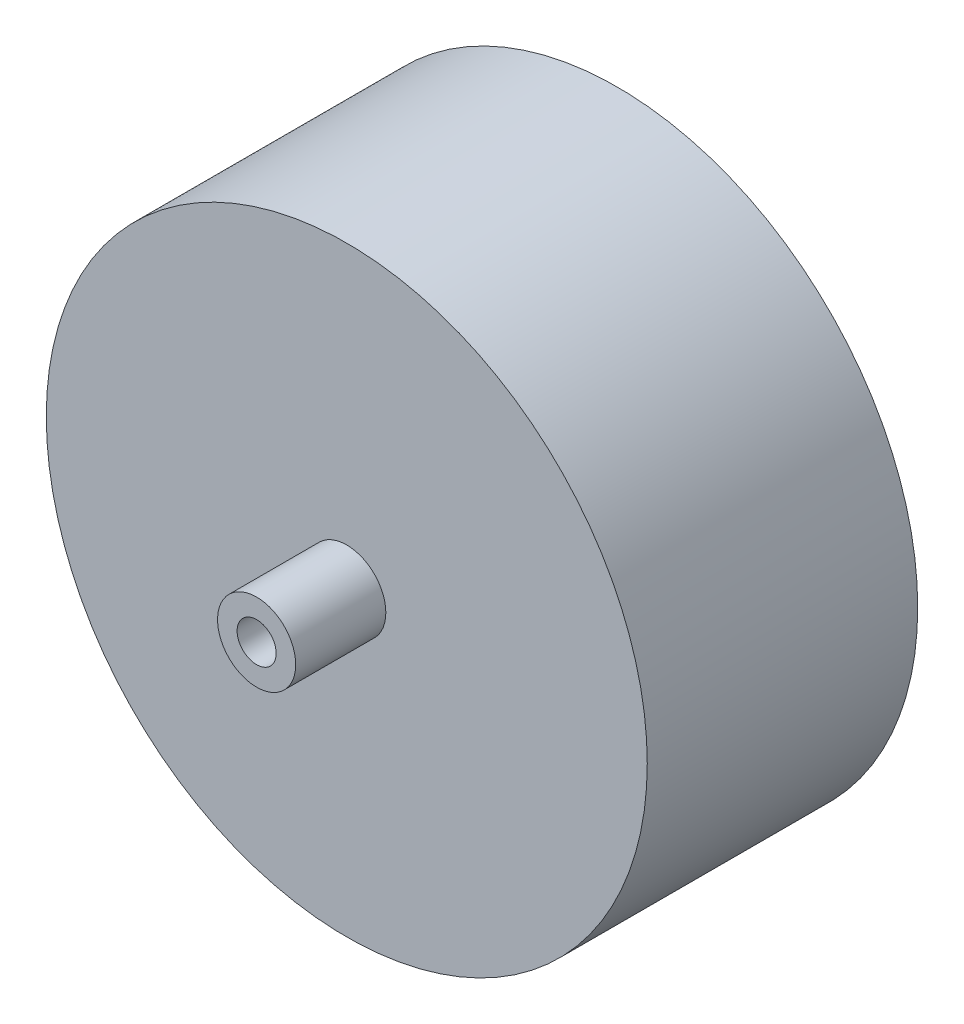
ISO-10303-21;
HEADER;
FILE_DESCRIPTION(('STEP AP214'),'2;1');
FILE_NAME('part.step','',(''),(''),'','','');
FILE_SCHEMA(('AUTOMOTIVE_DESIGN { 1 0 10303 214 1 1 1 1 }'));
ENDSEC;
DATA;
#1=APPLICATION_CONTEXT('core data for automotive mechanical design processes');
#2=APPLICATION_PROTOCOL_DEFINITION('international standard','automotive_design',2000,#1);
#3=PRODUCT_CONTEXT('',#1,'mechanical');
#4=PRODUCT('Part','Part','',(#3));
#5=PRODUCT_RELATED_PRODUCT_CATEGORY('part','',(#4));
#6=PRODUCT_DEFINITION_FORMATION('','',#4);
#7=PRODUCT_DEFINITION_CONTEXT('part definition',#1,'design');
#8=PRODUCT_DEFINITION('design','',#6,#7);
#9=PRODUCT_DEFINITION_SHAPE('','',#8);
#10=(LENGTH_UNIT() NAMED_UNIT(*) SI_UNIT(.MILLI.,.METRE.));
#11=(NAMED_UNIT(*) PLANE_ANGLE_UNIT() SI_UNIT($,.RADIAN.));
#12=(NAMED_UNIT(*) SI_UNIT($,.STERADIAN.) SOLID_ANGLE_UNIT());
#13=UNCERTAINTY_MEASURE_WITH_UNIT(LENGTH_MEASURE(1.E-05),#10,'distance_accuracy_value','');
#14=(GEOMETRIC_REPRESENTATION_CONTEXT(3) GLOBAL_UNCERTAINTY_ASSIGNED_CONTEXT((#13)) GLOBAL_UNIT_ASSIGNED_CONTEXT((#10,
#11,#12)) REPRESENTATION_CONTEXT('',''));
#15=CARTESIAN_POINT('',(0.,0.,0.));
#16=DIRECTION('',(0.,0.,1.));
#17=DIRECTION('',(1.,0.,0.));
#18=AXIS2_PLACEMENT_3D('',#15,#16,#17);
#19=CARTESIAN_POINT('',(0.,0.,45.));
#20=DIRECTION('',(0.,0.,-1.));
#21=DIRECTION('',(-1.,0.,0.));
#22=AXIS2_PLACEMENT_3D('',#19,#20,#21);
#23=CYLINDRICAL_SURFACE('',#22,50.);
#24=CARTESIAN_POINT('',(0.,0.,45.));
#25=DIRECTION('',(0.,0.,1.));
#26=DIRECTION('',(1.,0.,0.));
#27=AXIS2_PLACEMENT_3D('',#24,#25,#26);
#28=CIRCLE('',#27,50.);
#29=CARTESIAN_POINT('',(-50.,0.,45.));
#30=VERTEX_POINT('',#29);
#31=EDGE_CURVE('E42',#30,#30,#28,.T.);
#32=CARTESIAN_POINT('',(0.,0.,0.));
#33=DIRECTION('',(0.,0.,1.));
#34=DIRECTION('',(1.,0.,0.));
#35=AXIS2_PLACEMENT_3D('',#32,#33,#34);
#36=CIRCLE('',#35,50.);
#37=CARTESIAN_POINT('',(-50.,0.,0.));
#38=VERTEX_POINT('',#37);
#39=EDGE_CURVE('E37',#38,#38,#36,.T.);
#40=CARTESIAN_POINT('',(-50.,0.,45.));
#41=CARTESIAN_POINT('',(-50.,0.,44.53125));
#42=CARTESIAN_POINT('',(-50.,0.,44.0625));
#43=CARTESIAN_POINT('',(-50.,0.,43.125));
#44=CARTESIAN_POINT('',(-50.,0.,42.65625));
#45=CARTESIAN_POINT('',(-50.,0.,41.71875));
#46=CARTESIAN_POINT('',(-50.,0.,41.25));
#47=CARTESIAN_POINT('',(-50.,0.,40.3125));
#48=CARTESIAN_POINT('',(-50.,0.,39.84375));
#49=CARTESIAN_POINT('',(-50.,0.,38.90625));
#50=CARTESIAN_POINT('',(-50.,0.,38.4375));
#51=CARTESIAN_POINT('',(-50.,0.,37.5));
#52=CARTESIAN_POINT('',(-50.,0.,37.03125));
#53=CARTESIAN_POINT('',(-50.,0.,36.09375));
#54=CARTESIAN_POINT('',(-50.,0.,35.625));
#55=CARTESIAN_POINT('',(-50.,0.,34.6875));
#56=CARTESIAN_POINT('',(-50.,0.,34.21875));
#57=CARTESIAN_POINT('',(-50.,0.,33.28125));
#58=CARTESIAN_POINT('',(-50.,0.,32.8125));
#59=CARTESIAN_POINT('',(-50.,0.,31.875));
#60=CARTESIAN_POINT('',(-50.,0.,31.40625));
#61=CARTESIAN_POINT('',(-50.,0.,30.46875));
#62=CARTESIAN_POINT('',(-50.,0.,30.));
#63=CARTESIAN_POINT('',(-50.,0.,29.0625));
#64=CARTESIAN_POINT('',(-50.,0.,28.59375));
#65=CARTESIAN_POINT('',(-50.,0.,27.65625));
#66=CARTESIAN_POINT('',(-50.,0.,27.1875));
#67=CARTESIAN_POINT('',(-50.,0.,26.25));
#68=CARTESIAN_POINT('',(-50.,0.,25.78125));
#69=CARTESIAN_POINT('',(-50.,0.,24.84375));
#70=CARTESIAN_POINT('',(-50.,0.,24.375));
#71=CARTESIAN_POINT('',(-50.,0.,23.4375));
#72=CARTESIAN_POINT('',(-50.,0.,22.96875));
#73=CARTESIAN_POINT('',(-50.,0.,22.03125));
#74=CARTESIAN_POINT('',(-50.,0.,21.5625));
#75=CARTESIAN_POINT('',(-50.,0.,20.625));
#76=CARTESIAN_POINT('',(-50.,0.,20.15625));
#77=CARTESIAN_POINT('',(-50.,0.,19.21875));
#78=CARTESIAN_POINT('',(-50.,0.,18.75));
#79=CARTESIAN_POINT('',(-50.,0.,17.8125));
#80=CARTESIAN_POINT('',(-50.,0.,17.34375));
#81=CARTESIAN_POINT('',(-50.,0.,16.40625));
#82=CARTESIAN_POINT('',(-50.,0.,15.9375));
#83=CARTESIAN_POINT('',(-50.,0.,15.));
#84=CARTESIAN_POINT('',(-50.,0.,14.53125));
#85=CARTESIAN_POINT('',(-50.,0.,13.59375));
#86=CARTESIAN_POINT('',(-50.,0.,13.125));
#87=CARTESIAN_POINT('',(-50.,0.,12.1875));
#88=CARTESIAN_POINT('',(-50.,0.,11.71875));
#89=CARTESIAN_POINT('',(-50.,0.,10.78125));
#90=CARTESIAN_POINT('',(-50.,0.,10.3125));
#91=CARTESIAN_POINT('',(-50.,0.,9.375));
#92=CARTESIAN_POINT('',(-50.,0.,8.90625));
#93=CARTESIAN_POINT('',(-50.,0.,7.96874999999999));
#94=CARTESIAN_POINT('',(-50.,0.,7.5));
#95=CARTESIAN_POINT('',(-50.,0.,6.5625));
#96=CARTESIAN_POINT('',(-50.,0.,6.09375));
#97=CARTESIAN_POINT('',(-50.,0.,5.15625));
#98=CARTESIAN_POINT('',(-50.,0.,4.68749999999999));
#99=CARTESIAN_POINT('',(-50.,0.,3.74999999999999));
#100=CARTESIAN_POINT('',(-50.,0.,3.28124999999999));
#101=CARTESIAN_POINT('',(-50.,0.,2.34374999999999));
#102=CARTESIAN_POINT('',(-50.,0.,1.87499999999999));
#103=CARTESIAN_POINT('',(-50.,0.,0.937499999999992));
#104=CARTESIAN_POINT('',(-50.,0.,0.468749999999993));
#105=CARTESIAN_POINT('',(-50.,0.,0.));
#106=B_SPLINE_CURVE_WITH_KNOTS('',3,(#40,#41,#42,#43,#44,#45,#46,#47,#48,#49,#50,#51,#52,#53,
#54,#55,#56,#57,#58,#59,#60,#61,#62,#63,#64,#65,#66,#67,#68,#69,#70,#71,#72,#73,#74,#75,#76,#77,
#78,#79,#80,#81,#82,#83,#84,#85,#86,#87,#88,#89,#90,#91,#92,#93,#94,#95,#96,#97,#98,#99,#100,
#101,#102,#103,#104,#105),.UNSPECIFIED.,.F.,.F.,(4,2,2,2,2,2,2,2,2,2,2,2,2,2,2,2,2,2,2,2,2,2,2,
2,2,2,2,2,2,2,2,2,4),(0.,1.40625,2.8125,4.21875000000001,5.62500000000001,7.03125,8.4375,
9.84375000000001,11.25,12.65625,14.0625,15.46875,16.875,18.28125,19.6875,21.09375,22.5,23.90625,
25.3125,26.71875,28.125,29.53125,30.9375,32.34375,33.75,35.15625,36.5625,37.96875,39.375,
40.78125,42.1875,43.59375,45.),.UNSPECIFIED.);
#107=EDGE_CURVE('BSEAM40',#30,#38,#106,.T.);
#108=ORIENTED_EDGE('',*,*,#31,.F.);
#109=ORIENTED_EDGE('',*,*,#39,.T.);
#110=ORIENTED_EDGE('',*,*,#107,.T.);
#111=ORIENTED_EDGE('',*,*,#107,.F.);
#112=EDGE_LOOP('',(#108,#110,#109,#111));
#113=FACE_BOUND('',#112,.T.);
#114=ADVANCED_FACE('F40',(#113),#23,.T.);
#115=CARTESIAN_POINT('',(0.,0.,45.));
#116=DIRECTION('',(0.,0.,1.));
#117=DIRECTION('',(1.,0.,0.));
#118=AXIS2_PLACEMENT_3D('',#115,#116,#117);
#119=PLANE('',#118);
#120=CARTESIAN_POINT('',(0.,0.,45.));
#121=DIRECTION('',(0.,0.,1.));
#122=DIRECTION('',(1.,0.,0.));
#123=AXIS2_PLACEMENT_3D('',#120,#121,#122);
#124=CIRCLE('',#123,6.5);
#125=CARTESIAN_POINT('',(6.5,0.,45.));
#126=VERTEX_POINT('',#125);
#127=EDGE_CURVE('E10',#126,#126,#124,.T.);
#128=ORIENTED_EDGE('',*,*,#127,.F.);
#129=EDGE_LOOP('',(#128));
#130=FACE_BOUND('',#129,.T.);
#131=ORIENTED_EDGE('',*,*,#31,.T.);
#132=EDGE_LOOP('',(#131));
#133=FACE_BOUND('',#132,.T.);
#134=ADVANCED_FACE('F85',(#130,#133),#119,.T.);
#135=CARTESIAN_POINT('',(0.,0.,0.));
#136=DIRECTION('',(0.,0.,1.));
#137=DIRECTION('',(1.,0.,0.));
#138=AXIS2_PLACEMENT_3D('',#135,#136,#137);
#139=PLANE('',#138);
#140=ORIENTED_EDGE('',*,*,#39,.F.);
#141=EDGE_LOOP('',(#140));
#142=FACE_BOUND('',#141,.T.);
#143=ADVANCED_FACE('F77',(#142),#139,.F.);
#144=CARTESIAN_POINT('',(0.,0.,60.));
#145=DIRECTION('',(0.,0.,-1.));
#146=DIRECTION('',(-1.,0.,0.));
#147=AXIS2_PLACEMENT_3D('',#144,#145,#146);
#148=CYLINDRICAL_SURFACE('',#147,6.5);
#149=CARTESIAN_POINT('',(0.,0.,60.));
#150=DIRECTION('',(0.,0.,1.));
#151=DIRECTION('',(1.,0.,0.));
#152=AXIS2_PLACEMENT_3D('',#149,#150,#151);
#153=CIRCLE('',#152,6.5);
#154=CARTESIAN_POINT('',(6.5,0.,60.));
#155=VERTEX_POINT('',#154);
#156=EDGE_CURVE('E49',#155,#155,#153,.T.);
#157=ORIENTED_EDGE('',*,*,#156,.F.);
#158=EDGE_LOOP('',(#157));
#159=FACE_BOUND('',#158,.T.);
#160=ORIENTED_EDGE('',*,*,#127,.T.);
#161=EDGE_LOOP('',(#160));
#162=FACE_BOUND('',#161,.T.);
#163=ADVANCED_FACE('F72',(#159,#162),#148,.T.);
#164=CARTESIAN_POINT('',(0.,0.,60.));
#165=DIRECTION('',(0.,0.,1.));
#166=DIRECTION('',(1.,0.,0.));
#167=AXIS2_PLACEMENT_3D('',#164,#165,#166);
#168=PLANE('',#167);
#169=CARTESIAN_POINT('',(0.,0.,60.));
#170=DIRECTION('',(0.,0.,1.));
#171=DIRECTION('',(1.,0.,0.));
#172=AXIS2_PLACEMENT_3D('',#169,#170,#171);
#173=CIRCLE('',#172,3.25);
#174=CARTESIAN_POINT('',(3.25,0.,60.));
#175=VERTEX_POINT('',#174);
#176=EDGE_CURVE('E53',#175,#175,#173,.T.);
#177=ORIENTED_EDGE('',*,*,#176,.F.);
#178=EDGE_LOOP('',(#177));
#179=FACE_BOUND('',#178,.T.);
#180=ORIENTED_EDGE('',*,*,#156,.T.);
#181=EDGE_LOOP('',(#180));
#182=FACE_BOUND('',#181,.T.);
#183=ADVANCED_FACE('F63',(#179,#182),#168,.T.);
#184=CARTESIAN_POINT('',(0.,0.,47.));
#185=DIRECTION('',(0.,0.,1.));
#186=DIRECTION('',(1.,0.,0.));
#187=AXIS2_PLACEMENT_3D('',#184,#185,#186);
#188=CYLINDRICAL_SURFACE('',#187,3.25);
#189=CARTESIAN_POINT('',(0.,0.,47.));
#190=DIRECTION('',(0.,0.,1.));
#191=DIRECTION('',(1.,0.,0.));
#192=AXIS2_PLACEMENT_3D('',#189,#190,#191);
#193=CIRCLE('',#192,3.25);
#194=CARTESIAN_POINT('',(3.25,0.,47.));
#195=VERTEX_POINT('',#194);
#196=EDGE_CURVE('E52',#195,#195,#193,.T.);
#197=CARTESIAN_POINT('',(3.25,0.,47.));
#198=CARTESIAN_POINT('',(3.25,0.,47.1354166666667));
#199=CARTESIAN_POINT('',(3.25,0.,47.2708333333333));
#200=CARTESIAN_POINT('',(3.25,0.,47.5416666666667));
#201=CARTESIAN_POINT('',(3.25,0.,47.6770833333333));
#202=CARTESIAN_POINT('',(3.25,0.,47.9479166666667));
#203=CARTESIAN_POINT('',(3.25,0.,48.0833333333333));
#204=CARTESIAN_POINT('',(3.25,0.,48.3541666666667));
#205=CARTESIAN_POINT('',(3.25,0.,48.4895833333333));
#206=CARTESIAN_POINT('',(3.25,0.,48.7604166666667));
#207=CARTESIAN_POINT('',(3.25,0.,48.8958333333333));
#208=CARTESIAN_POINT('',(3.25,0.,49.1666666666667));
#209=CARTESIAN_POINT('',(3.25,0.,49.3020833333333));
#210=CARTESIAN_POINT('',(3.25,0.,49.5729166666667));
#211=CARTESIAN_POINT('',(3.25,0.,49.7083333333333));
#212=CARTESIAN_POINT('',(3.25,0.,49.9791666666667));
#213=CARTESIAN_POINT('',(3.25,0.,50.1145833333333));
#214=CARTESIAN_POINT('',(3.25,0.,50.3854166666667));
#215=CARTESIAN_POINT('',(3.25,0.,50.5208333333333));
#216=CARTESIAN_POINT('',(3.25,0.,50.7916666666667));
#217=CARTESIAN_POINT('',(3.25,0.,50.9270833333333));
#218=CARTESIAN_POINT('',(3.25,0.,51.1979166666667));
#219=CARTESIAN_POINT('',(3.25,0.,51.3333333333333));
#220=CARTESIAN_POINT('',(3.25,0.,51.6041666666667));
#221=CARTESIAN_POINT('',(3.25,0.,51.7395833333333));
#222=CARTESIAN_POINT('',(3.25,0.,52.0104166666667));
#223=CARTESIAN_POINT('',(3.25,0.,52.1458333333333));
#224=CARTESIAN_POINT('',(3.25,0.,52.4166666666667));
#225=CARTESIAN_POINT('',(3.25,0.,52.5520833333333));
#226=CARTESIAN_POINT('',(3.25,0.,52.8229166666667));
#227=CARTESIAN_POINT('',(3.25,0.,52.9583333333333));
#228=CARTESIAN_POINT('',(3.25,0.,53.2291666666667));
#229=CARTESIAN_POINT('',(3.25,0.,53.3645833333333));
#230=CARTESIAN_POINT('',(3.25,0.,53.6354166666667));
#231=CARTESIAN_POINT('',(3.25,0.,53.7708333333333));
#232=CARTESIAN_POINT('',(3.25,0.,54.0416666666667));
#233=CARTESIAN_POINT('',(3.25,0.,54.1770833333333));
#234=CARTESIAN_POINT('',(3.25,0.,54.4479166666667));
#235=CARTESIAN_POINT('',(3.25,0.,54.5833333333333));
#236=CARTESIAN_POINT('',(3.25,0.,54.8541666666667));
#237=CARTESIAN_POINT('',(3.25,0.,54.9895833333333));
#238=CARTESIAN_POINT('',(3.25,0.,55.2604166666667));
#239=CARTESIAN_POINT('',(3.25,0.,55.3958333333333));
#240=CARTESIAN_POINT('',(3.25,0.,55.6666666666667));
#241=CARTESIAN_POINT('',(3.25,0.,55.8020833333333));
#242=CARTESIAN_POINT('',(3.25,0.,56.0729166666667));
#243=CARTESIAN_POINT('',(3.25,0.,56.2083333333333));
#244=CARTESIAN_POINT('',(3.25,0.,56.4791666666667));
#245=CARTESIAN_POINT('',(3.25,0.,56.6145833333333));
#246=CARTESIAN_POINT('',(3.25,0.,56.8854166666667));
#247=CARTESIAN_POINT('',(3.25,0.,57.0208333333333));
#248=CARTESIAN_POINT('',(3.25,0.,57.2916666666667));
#249=CARTESIAN_POINT('',(3.25,0.,57.4270833333333));
#250=CARTESIAN_POINT('',(3.25,0.,57.6979166666667));
#251=CARTESIAN_POINT('',(3.25,0.,57.8333333333333));
#252=CARTESIAN_POINT('',(3.25,0.,58.1041666666667));
#253=CARTESIAN_POINT('',(3.25,0.,58.2395833333333));
#254=CARTESIAN_POINT('',(3.25,0.,58.5104166666667));
#255=CARTESIAN_POINT('',(3.25,0.,58.6458333333333));
#256=CARTESIAN_POINT('',(3.25,0.,58.9166666666667));
#257=CARTESIAN_POINT('',(3.25,0.,59.0520833333333));
#258=CARTESIAN_POINT('',(3.25,0.,59.3229166666667));
#259=CARTESIAN_POINT('',(3.25,0.,59.4583333333333));
#260=CARTESIAN_POINT('',(3.25,0.,59.7291666666667));
#261=CARTESIAN_POINT('',(3.25,0.,59.8645833333333));
#262=CARTESIAN_POINT('',(3.25,0.,60.));
#263=B_SPLINE_CURVE_WITH_KNOTS('',3,(#197,#198,#199,#200,#201,#202,#203,#204,#205,#206,#207,
#208,#209,#210,#211,#212,#213,#214,#215,#216,#217,#218,#219,#220,#221,#222,#223,#224,#225,#226,
#227,#228,#229,#230,#231,#232,#233,#234,#235,#236,#237,#238,#239,#240,#241,#242,#243,#244,#245,
#246,#247,#248,#249,#250,#251,#252,#253,#254,#255,#256,#257,#258,#259,#260,#261,#262),
.UNSPECIFIED.,.F.,.F.,(4,2,2,2,2,2,2,2,2,2,2,2,2,2,2,2,2,2,2,2,2,2,2,2,2,2,2,2,2,2,2,2,4),(0.,
0.406250000000004,0.812500000000001,1.21875,1.625,2.03125000000001,2.4375,2.84375,3.25,3.65625,
4.0625,4.46875,4.875,5.28125,5.68750000000001,6.09375,6.5,6.90625,7.3125,7.71875,8.125,8.53125,
8.9375,9.34375,9.75,10.15625,10.5625,10.96875,11.375,11.78125,12.1875,12.59375,13.),.UNSPECIFIED.);
#264=EDGE_CURVE('BSEAM65',#195,#175,#263,.T.);
#265=ORIENTED_EDGE('',*,*,#196,.F.);
#266=ORIENTED_EDGE('',*,*,#176,.T.);
#267=ORIENTED_EDGE('',*,*,#264,.T.);
#268=ORIENTED_EDGE('',*,*,#264,.F.);
#269=EDGE_LOOP('',(#265,#267,#266,#268));
#270=FACE_BOUND('',#269,.T.);
#271=ADVANCED_FACE('F65',(#270),#188,.F.);
#272=CARTESIAN_POINT('',(0.,0.,47.));
#273=DIRECTION('',(0.,0.,1.));
#274=DIRECTION('',(1.,0.,0.));
#275=AXIS2_PLACEMENT_3D('',#272,#273,#274);
#276=PLANE('',#275);
#277=ORIENTED_EDGE('',*,*,#196,.T.);
#278=EDGE_LOOP('',(#277));
#279=FACE_BOUND('',#278,.T.);
#280=ADVANCED_FACE('F58',(#279),#276,.T.);
#281=CLOSED_SHELL('',(#114,#134,#143,#163,#183,#271,#280));
#282=MANIFOLD_SOLID_BREP('B2',#281);
#283=ADVANCED_BREP_SHAPE_REPRESENTATION('',(#18,#282),#14);
#284=SHAPE_DEFINITION_REPRESENTATION(#9,#283);
ENDSEC;
END-ISO-10303-21;
